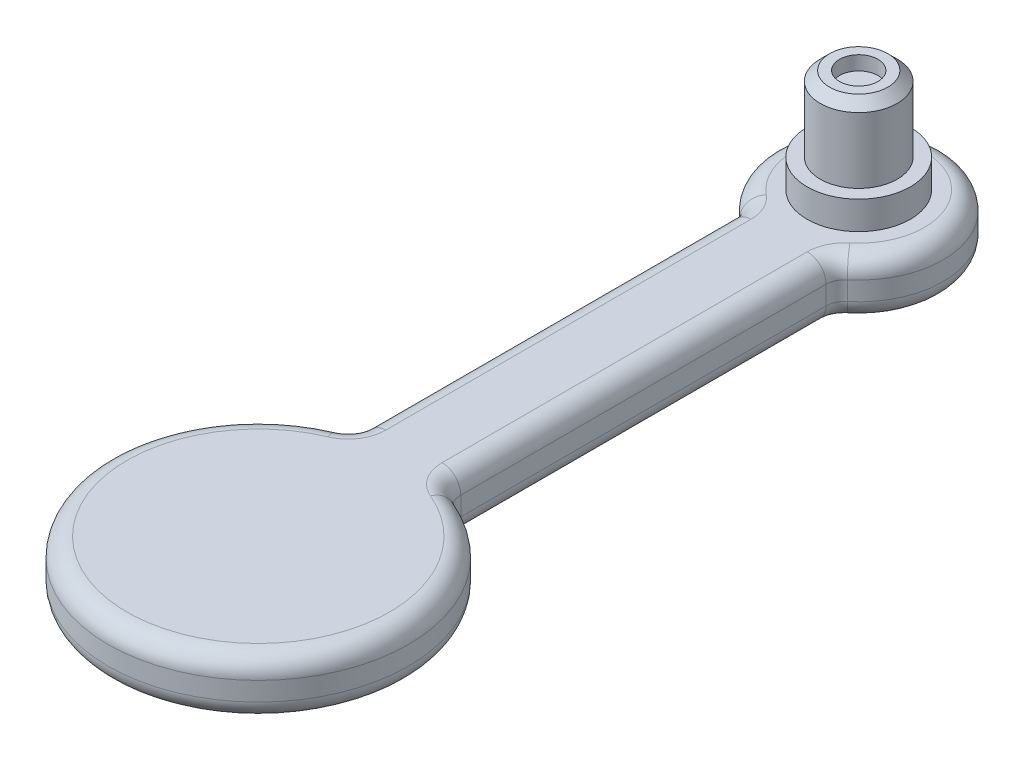
ISO-10303-21;
HEADER;
FILE_DESCRIPTION(('STEP AP214'),'2;1');
FILE_NAME('part.step','',(''),(''),'','','');
FILE_SCHEMA(('AUTOMOTIVE_DESIGN { 1 0 10303 214 1 1 1 1 }'));
ENDSEC;
DATA;
#1=APPLICATION_CONTEXT('core data for automotive mechanical design processes');
#2=APPLICATION_PROTOCOL_DEFINITION('international standard','automotive_design',2000,#1);
#3=PRODUCT_CONTEXT('',#1,'mechanical');
#4=PRODUCT('Part','Part','',(#3));
#5=PRODUCT_RELATED_PRODUCT_CATEGORY('part','',(#4));
#6=PRODUCT_DEFINITION_FORMATION('','',#4);
#7=PRODUCT_DEFINITION_CONTEXT('part definition',#1,'design');
#8=PRODUCT_DEFINITION('design','',#6,#7);
#9=PRODUCT_DEFINITION_SHAPE('','',#8);
#10=(LENGTH_UNIT() NAMED_UNIT(*) SI_UNIT(.MILLI.,.METRE.));
#11=(NAMED_UNIT(*) PLANE_ANGLE_UNIT() SI_UNIT($,.RADIAN.));
#12=(NAMED_UNIT(*) SI_UNIT($,.STERADIAN.) SOLID_ANGLE_UNIT());
#13=UNCERTAINTY_MEASURE_WITH_UNIT(LENGTH_MEASURE(1.E-05),#10,'distance_accuracy_value','');
#14=(GEOMETRIC_REPRESENTATION_CONTEXT(3) GLOBAL_UNCERTAINTY_ASSIGNED_CONTEXT((#13)) GLOBAL_UNIT_ASSIGNED_CONTEXT((#10,
#11,#12)) REPRESENTATION_CONTEXT('',''));
#15=CARTESIAN_POINT('',(0.,0.,0.));
#16=DIRECTION('',(0.,0.,1.));
#17=DIRECTION('',(1.,0.,0.));
#18=AXIS2_PLACEMENT_3D('',#15,#16,#17);
#19=CARTESIAN_POINT('',(0.,12.5,0.));
#20=DIRECTION('',(0.,-1.,0.));
#21=DIRECTION('',(0.,0.,-1.));
#22=AXIS2_PLACEMENT_3D('',#19,#20,#21);
#23=PLANE('',#22);
#24=CARTESIAN_POINT('',(0.,12.5,0.));
#25=DIRECTION('',(0.,-1.,0.));
#26=DIRECTION('',(1.,0.,0.));
#27=AXIS2_PLACEMENT_3D('',#24,#25,#26);
#28=CIRCLE('',#27,2.05);
#29=CARTESIAN_POINT('',(2.05,12.5,0.));
#30=VERTEX_POINT('',#29);
#31=EDGE_CURVE('E317',#30,#30,#28,.T.);
#32=ORIENTED_EDGE('',*,*,#31,.F.);
#33=EDGE_LOOP('',(#32));
#34=FACE_BOUND('',#33,.T.);
#35=ADVANCED_FACE('F18',(#34),#23,.F.);
#36=CARTESIAN_POINT('',(0.,14.5,0.));
#37=DIRECTION('',(0.,1.,0.));
#38=DIRECTION('',(1.,0.,0.));
#39=AXIS2_PLACEMENT_3D('',#36,#37,#38);
#40=CYLINDRICAL_SURFACE('',#39,2.05);
#41=ORIENTED_EDGE('',*,*,#31,.T.);
#42=EDGE_LOOP('',(#41));
#43=FACE_BOUND('',#42,.T.);
#44=CARTESIAN_POINT('',(0.,14.,0.));
#45=DIRECTION('',(0.,1.,0.));
#46=DIRECTION('',(1.,0.,0.));
#47=AXIS2_PLACEMENT_3D('',#44,#45,#46);
#48=CIRCLE('',#47,2.05);
#49=CARTESIAN_POINT('',(2.05,14.,0.));
#50=VERTEX_POINT('',#49);
#51=EDGE_CURVE('E322',#50,#50,#48,.T.);
#52=ORIENTED_EDGE('',*,*,#51,.T.);
#53=EDGE_LOOP('',(#52));
#54=FACE_BOUND('',#53,.T.);
#55=ADVANCED_FACE('F749',(#43,#54),#40,.F.);
#56=CARTESIAN_POINT('',(0.,14.,0.));
#57=DIRECTION('',(0.,1.,0.));
#58=DIRECTION('',(1.,0.,0.));
#59=AXIS2_PLACEMENT_3D('',#56,#57,#58);
#60=PLANE('',#59);
#61=ORIENTED_EDGE('',*,*,#51,.F.);
#62=EDGE_LOOP('',(#61));
#63=FACE_BOUND('',#62,.T.);
#64=CARTESIAN_POINT('',(0.,14.,0.));
#65=DIRECTION('',(0.,1.,0.));
#66=DIRECTION('',(1.,0.,0.));
#67=AXIS2_PLACEMENT_3D('',#64,#65,#66);
#68=CIRCLE('',#67,3.1);
#69=CARTESIAN_POINT('',(3.1,14.,0.));
#70=VERTEX_POINT('',#69);
#71=EDGE_CURVE('E390',#70,#70,#68,.T.);
#72=ORIENTED_EDGE('',*,*,#71,.T.);
#73=EDGE_LOOP('',(#72));
#74=FACE_BOUND('',#73,.T.);
#75=ADVANCED_FACE('F739',(#63,#74),#60,.T.);
#76=CARTESIAN_POINT('',(0.,13.,0.));
#77=DIRECTION('',(0.,-1.,0.));
#78=DIRECTION('',(1.,0.,0.));
#79=AXIS2_PLACEMENT_3D('',#76,#77,#78);
#80=CONICAL_SURFACE('',#79,4.1,0.785398163397);
#81=ORIENTED_EDGE('',*,*,#71,.F.);
#82=EDGE_LOOP('',(#81));
#83=FACE_BOUND('',#82,.T.);
#84=CARTESIAN_POINT('',(0.,13.,0.));
#85=DIRECTION('',(0.,1.,0.));
#86=DIRECTION('',(1.,0.,0.));
#87=AXIS2_PLACEMENT_3D('',#84,#85,#86);
#88=CIRCLE('',#87,4.1);
#89=CARTESIAN_POINT('',(4.1,13.,0.));
#90=VERTEX_POINT('',#89);
#91=EDGE_CURVE('E360',#90,#90,#88,.T.);
#92=ORIENTED_EDGE('',*,*,#91,.T.);
#93=EDGE_LOOP('',(#92));
#94=FACE_BOUND('',#93,.T.);
#95=ADVANCED_FACE('F729',(#83,#94),#80,.T.);
#96=CARTESIAN_POINT('',(0.,6.,0.));
#97=DIRECTION('',(0.,1.,0.));
#98=DIRECTION('',(1.,0.,0.));
#99=AXIS2_PLACEMENT_3D('',#96,#97,#98);
#100=CYLINDRICAL_SURFACE('',#99,4.1);
#101=ORIENTED_EDGE('',*,*,#91,.F.);
#102=EDGE_LOOP('',(#101));
#103=FACE_BOUND('',#102,.T.);
#104=CARTESIAN_POINT('',(0.,6.,0.));
#105=DIRECTION('',(0.,1.,0.));
#106=DIRECTION('',(1.,0.,0.));
#107=AXIS2_PLACEMENT_3D('',#104,#105,#106);
#108=CIRCLE('',#107,4.1);
#109=CARTESIAN_POINT('',(4.1,6.,0.));
#110=VERTEX_POINT('',#109);
#111=EDGE_CURVE('E341',#110,#110,#108,.T.);
#112=ORIENTED_EDGE('',*,*,#111,.T.);
#113=EDGE_LOOP('',(#112));
#114=FACE_BOUND('',#113,.T.);
#115=ADVANCED_FACE('F718',(#103,#114),#100,.T.);
#116=CARTESIAN_POINT('',(0.,6.,0.));
#117=DIRECTION('',(0.,1.,0.));
#118=DIRECTION('',(1.,0.,0.));
#119=AXIS2_PLACEMENT_3D('',#116,#117,#118);
#120=PLANE('',#119);
#121=ORIENTED_EDGE('',*,*,#111,.F.);
#122=EDGE_LOOP('',(#121));
#123=FACE_BOUND('',#122,.T.);
#124=CARTESIAN_POINT('',(0.,6.,0.));
#125=DIRECTION('',(0.,1.,0.));
#126=DIRECTION('',(1.,0.,0.));
#127=AXIS2_PLACEMENT_3D('',#124,#125,#126);
#128=CIRCLE('',#127,5.5);
#129=CARTESIAN_POINT('',(5.5,6.,0.));
#130=VERTEX_POINT('',#129);
#131=EDGE_CURVE('E345',#130,#130,#128,.T.);
#132=ORIENTED_EDGE('',*,*,#131,.T.);
#133=EDGE_LOOP('',(#132));
#134=FACE_BOUND('',#133,.T.);
#135=ADVANCED_FACE('F711',(#123,#134),#120,.T.);
#136=CARTESIAN_POINT('',(0.,3.,0.));
#137=DIRECTION('',(0.,1.,0.));
#138=DIRECTION('',(1.,0.,0.));
#139=AXIS2_PLACEMENT_3D('',#136,#137,#138);
#140=CYLINDRICAL_SURFACE('',#139,9.);
#141=CARTESIAN_POINT('',(0.,1.001,0.));
#142=DIRECTION('',(0.,-1.,0.));
#143=DIRECTION('',(-0.636363636363789,0.,0.771389215839744));
#144=AXIS2_PLACEMENT_3D('',#141,#142,#143);
#145=CIRCLE('',#144,9.);
#146=CARTESIAN_POINT('',(-5.727272727273,1.001,6.942502942559));
#147=VERTEX_POINT('',#146);
#148=CARTESIAN_POINT('',(5.727272727273,1.001,6.942502942559));
#149=VERTEX_POINT('',#148);
#150=EDGE_CURVE('E378',#147,#149,#145,.T.);
#151=ORIENTED_EDGE('',*,*,#150,.T.);
#152=DIRECTION('',(0.,1.,0.));
#153=VECTOR('',#152,1.);
#154=CARTESIAN_POINT('',(5.727272727273,-3.,6.942502942559));
#155=LINE('',#154,#153);
#156=CARTESIAN_POINT('',(5.727272727273,-1.001,6.942502942559));
#157=VERTEX_POINT('',#156);
#158=EDGE_CURVE('E225',#157,#149,#155,.T.);
#159=ORIENTED_EDGE('',*,*,#158,.F.);
#160=CARTESIAN_POINT('',(0.,-1.001,0.));
#161=DIRECTION('',(0.,1.,0.));
#162=DIRECTION('',(0.636363636363789,0.,0.771389215839744));
#163=AXIS2_PLACEMENT_3D('',#160,#161,#162);
#164=CIRCLE('',#163,9.);
#165=CARTESIAN_POINT('',(-5.727272727273,-1.001,6.942502942559));
#166=VERTEX_POINT('',#165);
#167=EDGE_CURVE('E273',#157,#166,#164,.T.);
#168=ORIENTED_EDGE('',*,*,#167,.T.);
#169=DIRECTION('',(0.,1.,0.));
#170=VECTOR('',#169,1.);
#171=CARTESIAN_POINT('',(-5.727272727273,-3.,6.942502942559));
#172=LINE('',#171,#170);
#173=EDGE_CURVE('E37',#166,#147,#172,.T.);
#174=ORIENTED_EDGE('',*,*,#173,.T.);
#175=EDGE_LOOP('',(#151,#159,#168,#174));
#176=FACE_BOUND('',#175,.T.);
#177=ADVANCED_FACE('F703',(#176),#140,.T.);
#178=CARTESIAN_POINT('',(-7.,-3.,8.485281374239));
#179=DIRECTION('',(0.,1.,0.));
#180=DIRECTION('',(1.,0.,0.));
#181=AXIS2_PLACEMENT_3D('',#178,#179,#180);
#182=CYLINDRICAL_SURFACE('',#181,2.);
#183=CARTESIAN_POINT('',(-7.,1.001,8.485281374239));
#184=DIRECTION('',(0.,1.,0.));
#185=DIRECTION('',(1.,0.,0.));
#186=AXIS2_PLACEMENT_3D('',#183,#184,#185);
#187=CIRCLE('',#186,2.);
#188=CARTESIAN_POINT('',(-5.,1.001,8.485281374239));
#189=VERTEX_POINT('',#188);
#190=EDGE_CURVE('E380',#189,#147,#187,.T.);
#191=ORIENTED_EDGE('',*,*,#190,.T.);
#192=ORIENTED_EDGE('',*,*,#173,.F.);
#193=CARTESIAN_POINT('',(-7.,-1.001,8.485281374239));
#194=DIRECTION('',(0.,-1.,0.));
#195=DIRECTION('',(0.636363636363789,0.,-0.771389215839744));
#196=AXIS2_PLACEMENT_3D('',#193,#194,#195);
#197=CIRCLE('',#196,2.);
#198=CARTESIAN_POINT('',(-5.,-1.001,8.485281374239));
#199=VERTEX_POINT('',#198);
#200=EDGE_CURVE('E364',#166,#199,#197,.T.);
#201=ORIENTED_EDGE('',*,*,#200,.T.);
#202=DIRECTION('',(0.,1.,0.));
#203=VECTOR('',#202,1.);
#204=CARTESIAN_POINT('',(-5.,-3.,8.485281374239));
#205=LINE('',#204,#203);
#206=EDGE_CURVE('E259',#199,#189,#205,.T.);
#207=ORIENTED_EDGE('',*,*,#206,.T.);
#208=EDGE_LOOP('',(#191,#192,#201,#207));
#209=FACE_BOUND('',#208,.T.);
#210=ADVANCED_FACE('F691',(#209),#182,.F.);
#211=CARTESIAN_POINT('',(0.,2.5,0.));
#212=DIRECTION('',(0.,1.,0.));
#213=DIRECTION('',(1.,0.,0.));
#214=AXIS2_PLACEMENT_3D('',#211,#212,#213);
#215=CYLINDRICAL_SURFACE('',#214,5.5);
#216=ORIENTED_EDGE('',*,*,#131,.F.);
#217=EDGE_LOOP('',(#216));
#218=FACE_BOUND('',#217,.T.);
#219=CARTESIAN_POINT('',(0.,3.,0.));
#220=DIRECTION('',(0.,1.,0.));
#221=DIRECTION('',(1.,0.,0.));
#222=AXIS2_PLACEMENT_3D('',#219,#220,#221);
#223=CIRCLE('',#222,5.5);
#224=CARTESIAN_POINT('',(5.5,3.,0.));
#225=VERTEX_POINT('',#224);
#226=EDGE_CURVE('E284',#225,#225,#223,.T.);
#227=ORIENTED_EDGE('',*,*,#226,.T.);
#228=EDGE_LOOP('',(#227));
#229=FACE_BOUND('',#228,.T.);
#230=ADVANCED_FACE('F682',(#218,#229),#215,.T.);
#231=CARTESIAN_POINT('',(0.,1.001,0.));
#232=DIRECTION('',(0.,1.,0.));
#233=DIRECTION('',(-0.636363636363789,0.,0.771389215839744));
#234=AXIS2_PLACEMENT_3D('',#231,#232,#233);
#235=TOROIDAL_SURFACE('',#234,7.001,1.999);
#236=CARTESIAN_POINT('',(0.,3.,0.));
#237=DIRECTION('',(0.,-1.,0.));
#238=DIRECTION('',(-0.636363636363789,0.,0.771389215839744));
#239=AXIS2_PLACEMENT_3D('',#236,#237,#238);
#240=CIRCLE('',#239,7.001);
#241=CARTESIAN_POINT('',(-4.455181818182,3.,5.400495900095));
#242=VERTEX_POINT('',#241);
#243=CARTESIAN_POINT('',(4.455181818182,3.,5.400495900095));
#244=VERTEX_POINT('',#243);
#245=EDGE_CURVE('E318',#242,#244,#240,.T.);
#246=ORIENTED_EDGE('',*,*,#245,.T.);
#247=CARTESIAN_POINT('',(4.455181818182,1.001,5.400495900095));
#248=DIRECTION('',(-0.771389215839744,0.,0.636363636363789));
#249=DIRECTION('',(0.636363636363789,0.,0.771389215839744));
#250=AXIS2_PLACEMENT_3D('',#247,#248,#249);
#251=CIRCLE('',#250,1.999);
#252=EDGE_CURVE('E305',#149,#244,#251,.T.);
#253=ORIENTED_EDGE('',*,*,#252,.F.);
#254=ORIENTED_EDGE('',*,*,#150,.F.);
#255=CARTESIAN_POINT('',(-4.455181818182,1.001,5.400495900095));
#256=DIRECTION('',(-0.771389215839744,0.,-0.636363636363789));
#257=DIRECTION('',(0.636363636363789,0.,-0.771389215839744));
#258=AXIS2_PLACEMENT_3D('',#255,#256,#257);
#259=CIRCLE('',#258,1.999);
#260=EDGE_CURVE('E303',#147,#242,#259,.T.);
#261=ORIENTED_EDGE('',*,*,#260,.T.);
#262=EDGE_LOOP('',(#246,#253,#254,#261));
#263=FACE_BOUND('',#262,.T.);
#264=ADVANCED_FACE('F673',(#263),#235,.T.);
#265=CARTESIAN_POINT('',(-7.,1.001,8.485281374239));
#266=DIRECTION('',(0.,-1.,0.));
#267=DIRECTION('',(1.,0.,0.));
#268=AXIS2_PLACEMENT_3D('',#265,#266,#267);
#269=TOROIDAL_SURFACE('',#268,3.999,1.999);
#270=CARTESIAN_POINT('',(-7.,3.,8.485281374239));
#271=DIRECTION('',(0.,1.,0.));
#272=DIRECTION('',(1.,0.,0.));
#273=AXIS2_PLACEMENT_3D('',#270,#271,#272);
#274=CIRCLE('',#273,3.999);
#275=CARTESIAN_POINT('',(-3.001,3.,8.485281374239));
#276=VERTEX_POINT('',#275);
#277=EDGE_CURVE('E327',#276,#242,#274,.T.);
#278=ORIENTED_EDGE('',*,*,#277,.T.);
#279=ORIENTED_EDGE('',*,*,#260,.F.);
#280=ORIENTED_EDGE('',*,*,#190,.F.);
#281=CARTESIAN_POINT('',(-3.001,1.001,8.485281374239));
#282=DIRECTION('',(0.,0.,-1.));
#283=DIRECTION('',(-1.,0.,0.));
#284=AXIS2_PLACEMENT_3D('',#281,#282,#283);
#285=CIRCLE('',#284,1.999);
#286=EDGE_CURVE('E280',#189,#276,#285,.T.);
#287=ORIENTED_EDGE('',*,*,#286,.T.);
#288=EDGE_LOOP('',(#278,#279,#280,#287));
#289=FACE_BOUND('',#288,.T.);
#290=ADVANCED_FACE('F664',(#289),#269,.T.);
#291=CARTESIAN_POINT('',(7.,1.001,8.485281374239));
#292=DIRECTION('',(0.,-1.,0.));
#293=DIRECTION('',(-0.636363636363789,0.,-0.771389215839744));
#294=AXIS2_PLACEMENT_3D('',#291,#292,#293);
#295=TOROIDAL_SURFACE('',#294,3.999,1.999);
#296=CARTESIAN_POINT('',(7.,3.,8.485281374239));
#297=DIRECTION('',(0.,1.,0.));
#298=DIRECTION('',(-0.636363636363789,0.,-0.771389215839744));
#299=AXIS2_PLACEMENT_3D('',#296,#297,#298);
#300=CIRCLE('',#299,3.999);
#301=CARTESIAN_POINT('',(3.001,3.,8.485281374239));
#302=VERTEX_POINT('',#301);
#303=EDGE_CURVE('E314',#244,#302,#300,.T.);
#304=ORIENTED_EDGE('',*,*,#303,.T.);
#305=CARTESIAN_POINT('',(3.001,1.001,8.485281374239));
#306=DIRECTION('',(0.,0.,1.));
#307=DIRECTION('',(-1.,0.,0.));
#308=AXIS2_PLACEMENT_3D('',#305,#306,#307);
#309=CIRCLE('',#308,1.999);
#310=CARTESIAN_POINT('',(5.,1.001,8.485281374239));
#311=VERTEX_POINT('',#310);
#312=EDGE_CURVE('E249',#311,#302,#309,.T.);
#313=ORIENTED_EDGE('',*,*,#312,.F.);
#314=CARTESIAN_POINT('',(7.,1.001,8.485281374239));
#315=DIRECTION('',(0.,1.,0.));
#316=DIRECTION('',(-0.636363636363789,0.,-0.771389215839744));
#317=AXIS2_PLACEMENT_3D('',#314,#315,#316);
#318=CIRCLE('',#317,2.);
#319=EDGE_CURVE('E244',#149,#311,#318,.T.);
#320=ORIENTED_EDGE('',*,*,#319,.F.);
#321=ORIENTED_EDGE('',*,*,#252,.T.);
#322=EDGE_LOOP('',(#304,#313,#320,#321));
#323=FACE_BOUND('',#322,.T.);
#324=ADVANCED_FACE('F653',(#323),#295,.T.);
#325=CARTESIAN_POINT('',(-3.001,1.001,47.416876048223));
#326=DIRECTION('',(0.,0.,-1.));
#327=DIRECTION('',(-1.,0.,0.));
#328=AXIS2_PLACEMENT_3D('',#325,#326,#327);
#329=CYLINDRICAL_SURFACE('',#328,1.999);
#330=CARTESIAN_POINT('',(-3.001,1.001,47.416876048223));
#331=DIRECTION('',(0.,0.,-1.));
#332=DIRECTION('',(1.,0.,0.));
#333=AXIS2_PLACEMENT_3D('',#330,#331,#332);
#334=CIRCLE('',#333,1.999);
#335=CARTESIAN_POINT('',(-5.,1.001,47.416876048223));
#336=VERTEX_POINT('',#335);
#337=CARTESIAN_POINT('',(-3.001,3.,47.416876048223));
#338=VERTEX_POINT('',#337);
#339=EDGE_CURVE('E339',#336,#338,#334,.T.);
#340=ORIENTED_EDGE('',*,*,#339,.T.);
#341=DIRECTION('',(0.,0.,-1.));
#342=VECTOR('',#341,1.);
#343=CARTESIAN_POINT('',(-3.001,3.,47.416876048223));
#344=LINE('',#343,#342);
#345=EDGE_CURVE('E283',#338,#276,#344,.T.);
#346=ORIENTED_EDGE('',*,*,#345,.T.);
#347=ORIENTED_EDGE('',*,*,#286,.F.);
#348=DIRECTION('',(0.,0.,-1.));
#349=VECTOR('',#348,1.);
#350=CARTESIAN_POINT('',(-5.,1.001,47.416876048223));
#351=LINE('',#350,#349);
#352=EDGE_CURVE('E344',#336,#189,#351,.T.);
#353=ORIENTED_EDGE('',*,*,#352,.F.);
#354=EDGE_LOOP('',(#340,#346,#347,#353));
#355=FACE_BOUND('',#354,.T.);
#356=ADVANCED_FACE('F641',(#355),#329,.T.);
#357=CARTESIAN_POINT('',(0.,-1.001,0.));
#358=DIRECTION('',(0.,-1.,0.));
#359=DIRECTION('',(0.636363636363789,0.,0.771389215839744));
#360=AXIS2_PLACEMENT_3D('',#357,#358,#359);
#361=TOROIDAL_SURFACE('',#360,7.001,1.999);
#362=CARTESIAN_POINT('',(0.,-3.,0.));
#363=DIRECTION('',(0.,1.,0.));
#364=DIRECTION('',(0.636363636363789,0.,0.771389215839744));
#365=AXIS2_PLACEMENT_3D('',#362,#363,#364);
#366=CIRCLE('',#365,7.001);
#367=CARTESIAN_POINT('',(4.455181818182,-3.,5.400495900095));
#368=VERTEX_POINT('',#367);
#369=CARTESIAN_POINT('',(-4.455181818182,-3.,5.400495900095));
#370=VERTEX_POINT('',#369);
#371=EDGE_CURVE('E302',#368,#370,#366,.T.);
#372=ORIENTED_EDGE('',*,*,#371,.T.);
#373=CARTESIAN_POINT('',(-4.455181818182,-1.001,5.400495900095));
#374=DIRECTION('',(0.771389215839744,0.,0.636363636363789));
#375=DIRECTION('',(-0.636363636363789,0.,0.771389215839744));
#376=AXIS2_PLACEMENT_3D('',#373,#374,#375);
#377=CIRCLE('',#376,1.999);
#378=EDGE_CURVE('E366',#166,#370,#377,.T.);
#379=ORIENTED_EDGE('',*,*,#378,.F.);
#380=ORIENTED_EDGE('',*,*,#167,.F.);
#381=CARTESIAN_POINT('',(4.455181818182,-1.001,5.400495900095));
#382=DIRECTION('',(0.771389215839744,0.,-0.636363636363789));
#383=DIRECTION('',(-0.636363636363789,0.,-0.771389215839744));
#384=AXIS2_PLACEMENT_3D('',#381,#382,#383);
#385=CIRCLE('',#384,1.999);
#386=EDGE_CURVE('E279',#157,#368,#385,.T.);
#387=ORIENTED_EDGE('',*,*,#386,.T.);
#388=EDGE_LOOP('',(#372,#379,#380,#387));
#389=FACE_BOUND('',#388,.T.);
#390=ADVANCED_FACE('F634',(#389),#361,.T.);
#391=CARTESIAN_POINT('',(7.,-1.001,8.485281374239));
#392=DIRECTION('',(0.,1.,0.));
#393=DIRECTION('',(-1.,0.,0.));
#394=AXIS2_PLACEMENT_3D('',#391,#392,#393);
#395=TOROIDAL_SURFACE('',#394,3.999,1.999);
#396=CARTESIAN_POINT('',(7.,-3.,8.485281374239));
#397=DIRECTION('',(0.,-1.,0.));
#398=DIRECTION('',(-1.,0.,0.));
#399=AXIS2_PLACEMENT_3D('',#396,#397,#398);
#400=CIRCLE('',#399,3.999);
#401=CARTESIAN_POINT('',(3.001,-3.,8.485281374239));
#402=VERTEX_POINT('',#401);
#403=EDGE_CURVE('E240',#402,#368,#400,.T.);
#404=ORIENTED_EDGE('',*,*,#403,.T.);
#405=ORIENTED_EDGE('',*,*,#386,.F.);
#406=CARTESIAN_POINT('',(7.,-1.001,8.485281374239));
#407=DIRECTION('',(0.,-1.,0.));
#408=DIRECTION('',(-1.,0.,0.));
#409=AXIS2_PLACEMENT_3D('',#406,#407,#408);
#410=CIRCLE('',#409,2.);
#411=CARTESIAN_POINT('',(5.,-1.001,8.485281374239));
#412=VERTEX_POINT('',#411);
#413=EDGE_CURVE('E227',#412,#157,#410,.T.);
#414=ORIENTED_EDGE('',*,*,#413,.F.);
#415=CARTESIAN_POINT('',(3.001,-1.001,8.485281374239));
#416=DIRECTION('',(0.,0.,-1.));
#417=DIRECTION('',(1.,0.,0.));
#418=AXIS2_PLACEMENT_3D('',#415,#416,#417);
#419=CIRCLE('',#418,1.999);
#420=EDGE_CURVE('E256',#412,#402,#419,.T.);
#421=ORIENTED_EDGE('',*,*,#420,.T.);
#422=EDGE_LOOP('',(#404,#405,#414,#421));
#423=FACE_BOUND('',#422,.T.);
#424=ADVANCED_FACE('F623',(#423),#395,.T.);
#425=CARTESIAN_POINT('',(-7.,-1.001,8.485281374239));
#426=DIRECTION('',(0.,1.,0.));
#427=DIRECTION('',(0.636363636363789,0.,-0.771389215839744));
#428=AXIS2_PLACEMENT_3D('',#425,#426,#427);
#429=TOROIDAL_SURFACE('',#428,3.999,1.999);
#430=CARTESIAN_POINT('',(-7.,-3.,8.485281374239));
#431=DIRECTION('',(0.,-1.,0.));
#432=DIRECTION('',(0.636363636363789,0.,-0.771389215839744));
#433=AXIS2_PLACEMENT_3D('',#430,#431,#432);
#434=CIRCLE('',#433,3.999);
#435=CARTESIAN_POINT('',(-3.001,-3.,8.485281374239));
#436=VERTEX_POINT('',#435);
#437=EDGE_CURVE('E300',#370,#436,#434,.T.);
#438=ORIENTED_EDGE('',*,*,#437,.T.);
#439=CARTESIAN_POINT('',(-3.001,-1.001,8.485281374239));
#440=DIRECTION('',(0.,0.,1.));
#441=DIRECTION('',(1.,0.,0.));
#442=AXIS2_PLACEMENT_3D('',#439,#440,#441);
#443=CIRCLE('',#442,1.999);
#444=EDGE_CURVE('E226',#199,#436,#443,.T.);
#445=ORIENTED_EDGE('',*,*,#444,.F.);
#446=ORIENTED_EDGE('',*,*,#200,.F.);
#447=ORIENTED_EDGE('',*,*,#378,.T.);
#448=EDGE_LOOP('',(#438,#445,#446,#447));
#449=FACE_BOUND('',#448,.T.);
#450=ADVANCED_FACE('F614',(#449),#429,.T.);
#451=CARTESIAN_POINT('',(-3.001,-1.001,8.485281374239));
#452=DIRECTION('',(0.,0.,1.));
#453=DIRECTION('',(-1.,0.,0.));
#454=AXIS2_PLACEMENT_3D('',#451,#452,#453);
#455=CYLINDRICAL_SURFACE('',#454,1.999);
#456=ORIENTED_EDGE('',*,*,#444,.T.);
#457=DIRECTION('',(0.,0.,1.));
#458=VECTOR('',#457,1.);
#459=CARTESIAN_POINT('',(-3.001,-3.,8.485281374239));
#460=LINE('',#459,#458);
#461=CARTESIAN_POINT('',(-3.001,-3.,47.416876048223));
#462=VERTEX_POINT('',#461);
#463=EDGE_CURVE('E292',#436,#462,#460,.T.);
#464=ORIENTED_EDGE('',*,*,#463,.T.);
#465=CARTESIAN_POINT('',(-3.001,-1.001,47.416876048223));
#466=DIRECTION('',(0.,0.,1.));
#467=DIRECTION('',(-1.,0.,0.));
#468=AXIS2_PLACEMENT_3D('',#465,#466,#467);
#469=CIRCLE('',#468,1.999);
#470=CARTESIAN_POINT('',(-5.,-1.001,47.416876048223));
#471=VERTEX_POINT('',#470);
#472=EDGE_CURVE('E289',#471,#462,#469,.T.);
#473=ORIENTED_EDGE('',*,*,#472,.F.);
#474=DIRECTION('',(0.,0.,1.));
#475=VECTOR('',#474,1.);
#476=CARTESIAN_POINT('',(-5.,-1.001,8.485281374239));
#477=LINE('',#476,#475);
#478=EDGE_CURVE('E254',#199,#471,#477,.T.);
#479=ORIENTED_EDGE('',*,*,#478,.F.);
#480=EDGE_LOOP('',(#456,#464,#473,#479));
#481=FACE_BOUND('',#480,.T.);
#482=ADVANCED_FACE('F603',(#481),#455,.T.);
#483=CARTESIAN_POINT('',(7.,-3.,8.485281374239));
#484=DIRECTION('',(0.,1.,0.));
#485=DIRECTION('',(-0.636363636363789,0.,-0.771389215839744));
#486=AXIS2_PLACEMENT_3D('',#483,#484,#485);
#487=CYLINDRICAL_SURFACE('',#486,2.);
#488=ORIENTED_EDGE('',*,*,#319,.T.);
#489=DIRECTION('',(0.,1.,0.));
#490=VECTOR('',#489,1.);
#491=CARTESIAN_POINT('',(5.,-3.,8.485281374239));
#492=LINE('',#491,#490);
#493=EDGE_CURVE('E178',#412,#311,#492,.T.);
#494=ORIENTED_EDGE('',*,*,#493,.F.);
#495=ORIENTED_EDGE('',*,*,#413,.T.);
#496=ORIENTED_EDGE('',*,*,#158,.T.);
#497=EDGE_LOOP('',(#488,#494,#495,#496));
#498=FACE_BOUND('',#497,.T.);
#499=ADVANCED_FACE('F594',(#498),#487,.F.);
#500=CARTESIAN_POINT('',(3.001,1.001,8.485281374239));
#501=DIRECTION('',(0.,0.,1.));
#502=DIRECTION('',(1.,0.,0.));
#503=AXIS2_PLACEMENT_3D('',#500,#501,#502);
#504=CYLINDRICAL_SURFACE('',#503,1.999);
#505=ORIENTED_EDGE('',*,*,#312,.T.);
#506=DIRECTION('',(0.,0.,1.));
#507=VECTOR('',#506,1.);
#508=CARTESIAN_POINT('',(3.001,3.,8.485281374239));
#509=LINE('',#508,#507);
#510=CARTESIAN_POINT('',(3.001,3.,47.416876048223));
#511=VERTEX_POINT('',#510);
#512=EDGE_CURVE('E187',#302,#511,#509,.T.);
#513=ORIENTED_EDGE('',*,*,#512,.T.);
#514=CARTESIAN_POINT('',(3.001,1.001,47.416876048223));
#515=DIRECTION('',(0.,0.,1.));
#516=DIRECTION('',(1.,0.,0.));
#517=AXIS2_PLACEMENT_3D('',#514,#515,#516);
#518=CIRCLE('',#517,1.999);
#519=CARTESIAN_POINT('',(5.,1.001,47.416876048223));
#520=VERTEX_POINT('',#519);
#521=EDGE_CURVE('E181',#520,#511,#518,.T.);
#522=ORIENTED_EDGE('',*,*,#521,.F.);
#523=DIRECTION('',(0.,0.,1.));
#524=VECTOR('',#523,1.);
#525=CARTESIAN_POINT('',(5.,1.001,8.485281374239));
#526=LINE('',#525,#524);
#527=EDGE_CURVE('E168',#311,#520,#526,.T.);
#528=ORIENTED_EDGE('',*,*,#527,.F.);
#529=EDGE_LOOP('',(#505,#513,#522,#528));
#530=FACE_BOUND('',#529,.T.);
#531=ADVANCED_FACE('F186',(#530),#504,.T.);
#532=CARTESIAN_POINT('',(3.001,-1.001,47.416876048223));
#533=DIRECTION('',(0.,0.,-1.));
#534=DIRECTION('',(1.,0.,0.));
#535=AXIS2_PLACEMENT_3D('',#532,#533,#534);
#536=CYLINDRICAL_SURFACE('',#535,1.999);
#537=CARTESIAN_POINT('',(3.001,-1.001,47.416876048223));
#538=DIRECTION('',(0.,0.,-1.));
#539=DIRECTION('',(-1.,0.,0.));
#540=AXIS2_PLACEMENT_3D('',#537,#538,#539);
#541=CIRCLE('',#540,1.999);
#542=CARTESIAN_POINT('',(5.,-1.001,47.416876048223));
#543=VERTEX_POINT('',#542);
#544=CARTESIAN_POINT('',(3.001,-3.,47.416876048223));
#545=VERTEX_POINT('',#544);
#546=EDGE_CURVE('E266',#543,#545,#541,.T.);
#547=ORIENTED_EDGE('',*,*,#546,.T.);
#548=DIRECTION('',(0.,0.,-1.));
#549=VECTOR('',#548,1.);
#550=CARTESIAN_POINT('',(3.001,-3.,47.416876048223));
#551=LINE('',#550,#549);
#552=EDGE_CURVE('E235',#545,#402,#551,.T.);
#553=ORIENTED_EDGE('',*,*,#552,.T.);
#554=ORIENTED_EDGE('',*,*,#420,.F.);
#555=DIRECTION('',(0.,0.,-1.));
#556=VECTOR('',#555,1.);
#557=CARTESIAN_POINT('',(5.,-1.001,47.416876048223));
#558=LINE('',#557,#556);
#559=EDGE_CURVE('E185',#543,#412,#558,.T.);
#560=ORIENTED_EDGE('',*,*,#559,.F.);
#561=EDGE_LOOP('',(#547,#553,#554,#560));
#562=FACE_BOUND('',#561,.T.);
#563=ADVANCED_FACE('F577',(#562),#536,.T.);
#564=CARTESIAN_POINT('',(-5.,3.,64.));
#565=DIRECTION('',(1.,0.,0.));
#566=DIRECTION('',(0.,1.,0.));
#567=AXIS2_PLACEMENT_3D('',#564,#565,#566);
#568=PLANE('',#567);
#569=ORIENTED_EDGE('',*,*,#352,.T.);
#570=ORIENTED_EDGE('',*,*,#206,.F.);
#571=ORIENTED_EDGE('',*,*,#478,.T.);
#572=DIRECTION('',(0.,1.,0.));
#573=VECTOR('',#572,1.);
#574=CARTESIAN_POINT('',(-5.,-3.,47.416876048223));
#575=LINE('',#574,#573);
#576=EDGE_CURVE('E216',#471,#336,#575,.T.);
#577=ORIENTED_EDGE('',*,*,#576,.T.);
#578=EDGE_LOOP('',(#569,#570,#571,#577));
#579=FACE_BOUND('',#578,.T.);
#580=ADVANCED_FACE('F570',(#579),#568,.F.);
#581=CARTESIAN_POINT('',(-7.,1.001,47.416876048223));
#582=DIRECTION('',(0.,-1.,0.));
#583=DIRECTION('',(0.388888888888844,0.,0.92128466398763));
#584=AXIS2_PLACEMENT_3D('',#581,#582,#583);
#585=TOROIDAL_SURFACE('',#584,3.999,1.999);
#586=CARTESIAN_POINT('',(-7.,3.,47.416876048223));
#587=DIRECTION('',(0.,1.,0.));
#588=DIRECTION('',(0.388888888888844,0.,0.92128466398763));
#589=AXIS2_PLACEMENT_3D('',#586,#587,#588);
#590=CIRCLE('',#589,3.999);
#591=CARTESIAN_POINT('',(-5.444833333333,3.,51.101093419509));
#592=VERTEX_POINT('',#591);
#593=EDGE_CURVE('E276',#592,#338,#590,.T.);
#594=ORIENTED_EDGE('',*,*,#593,.T.);
#595=ORIENTED_EDGE('',*,*,#339,.F.);
#596=CARTESIAN_POINT('',(-7.,1.001,47.416876048223));
#597=DIRECTION('',(0.,1.,0.));
#598=DIRECTION('',(0.388888888888844,0.,0.92128466398763));
#599=AXIS2_PLACEMENT_3D('',#596,#597,#598);
#600=CIRCLE('',#599,2.);
#601=CARTESIAN_POINT('',(-6.222222222222,1.001,49.259445376198));
#602=VERTEX_POINT('',#601);
#603=EDGE_CURVE('E222',#602,#336,#600,.T.);
#604=ORIENTED_EDGE('',*,*,#603,.F.);
#605=CARTESIAN_POINT('',(-5.444833333333,1.001,51.101093419509));
#606=DIRECTION('',(0.92128466398763,0.,-0.388888888888844));
#607=DIRECTION('',(-0.388888888888844,0.,-0.92128466398763));
#608=AXIS2_PLACEMENT_3D('',#605,#606,#607);
#609=CIRCLE('',#608,1.999);
#610=EDGE_CURVE('E253',#602,#592,#609,.T.);
#611=ORIENTED_EDGE('',*,*,#610,.T.);
#612=EDGE_LOOP('',(#594,#595,#604,#611));
#613=FACE_BOUND('',#612,.T.);
#614=ADVANCED_FACE('F553',(#613),#585,.T.);
#615=CARTESIAN_POINT('',(0.,3.,64.));
#616=DIRECTION('',(0.,-1.,0.));
#617=DIRECTION('',(0.,0.,-1.));
#618=AXIS2_PLACEMENT_3D('',#615,#616,#617);
#619=PLANE('',#618);
#620=ORIENTED_EDGE('',*,*,#226,.F.);
#621=EDGE_LOOP('',(#620));
#622=FACE_BOUND('',#621,.T.);
#623=CARTESIAN_POINT('',(7.,3.,47.416876048223));
#624=DIRECTION('',(0.,1.,0.));
#625=DIRECTION('',(-1.,0.,0.));
#626=AXIS2_PLACEMENT_3D('',#623,#624,#625);
#627=CIRCLE('',#626,3.999);
#628=CARTESIAN_POINT('',(5.444833333333,3.,51.101093419509));
#629=VERTEX_POINT('',#628);
#630=EDGE_CURVE('E195',#511,#629,#627,.T.);
#631=ORIENTED_EDGE('',*,*,#630,.F.);
#632=ORIENTED_EDGE('',*,*,#512,.F.);
#633=ORIENTED_EDGE('',*,*,#303,.F.);
#634=ORIENTED_EDGE('',*,*,#245,.F.);
#635=ORIENTED_EDGE('',*,*,#277,.F.);
#636=ORIENTED_EDGE('',*,*,#345,.F.);
#637=ORIENTED_EDGE('',*,*,#593,.F.);
#638=CARTESIAN_POINT('',(0.,3.,64.));
#639=DIRECTION('',(0.,-1.,0.));
#640=DIRECTION('',(0.388888888888844,0.,-0.92128466398763));
#641=AXIS2_PLACEMENT_3D('',#638,#639,#640);
#642=CIRCLE('',#641,14.001);
#643=EDGE_CURVE('E243',#629,#592,#642,.T.);
#644=ORIENTED_EDGE('',*,*,#643,.F.);
#645=EDGE_LOOP('',(#631,#632,#633,#634,#635,#636,#637,#644));
#646=FACE_BOUND('',#645,.T.);
#647=ADVANCED_FACE('F544',(#622,#646),#619,.F.);
#648=CARTESIAN_POINT('',(0.,-3.,64.));
#649=DIRECTION('',(0.,-1.,0.));
#650=DIRECTION('',(0.,0.,-1.));
#651=AXIS2_PLACEMENT_3D('',#648,#649,#650);
#652=PLANE('',#651);
#653=CARTESIAN_POINT('',(0.,-3.,64.));
#654=DIRECTION('',(0.,1.,0.));
#655=DIRECTION('',(-0.388888888888844,0.,-0.92128466398763));
#656=AXIS2_PLACEMENT_3D('',#653,#654,#655);
#657=CIRCLE('',#656,14.001);
#658=CARTESIAN_POINT('',(-5.444833333333,-3.,51.101093419509));
#659=VERTEX_POINT('',#658);
#660=CARTESIAN_POINT('',(5.444833333333,-3.,51.101093419509));
#661=VERTEX_POINT('',#660);
#662=EDGE_CURVE('E201',#659,#661,#657,.T.);
#663=ORIENTED_EDGE('',*,*,#662,.F.);
#664=CARTESIAN_POINT('',(-7.,-3.,47.416876048223));
#665=DIRECTION('',(0.,-1.,0.));
#666=DIRECTION('',(1.,0.,0.));
#667=AXIS2_PLACEMENT_3D('',#664,#665,#666);
#668=CIRCLE('',#667,3.999);
#669=EDGE_CURVE('E290',#462,#659,#668,.T.);
#670=ORIENTED_EDGE('',*,*,#669,.F.);
#671=ORIENTED_EDGE('',*,*,#463,.F.);
#672=ORIENTED_EDGE('',*,*,#437,.F.);
#673=ORIENTED_EDGE('',*,*,#371,.F.);
#674=ORIENTED_EDGE('',*,*,#403,.F.);
#675=ORIENTED_EDGE('',*,*,#552,.F.);
#676=CARTESIAN_POINT('',(7.,-3.,47.416876048223));
#677=DIRECTION('',(0.,-1.,0.));
#678=DIRECTION('',(-0.388888888888844,0.,0.92128466398763));
#679=AXIS2_PLACEMENT_3D('',#676,#677,#678);
#680=CIRCLE('',#679,3.999);
#681=EDGE_CURVE('E265',#661,#545,#680,.T.);
#682=ORIENTED_EDGE('',*,*,#681,.F.);
#683=EDGE_LOOP('',(#663,#670,#671,#672,#673,#674,#675,#682));
#684=FACE_BOUND('',#683,.T.);
#685=ADVANCED_FACE('F532',(#684),#652,.T.);
#686=CARTESIAN_POINT('',(-7.,-1.001,47.416876048223));
#687=DIRECTION('',(0.,1.,0.));
#688=DIRECTION('',(1.,0.,0.));
#689=AXIS2_PLACEMENT_3D('',#686,#687,#688);
#690=TOROIDAL_SURFACE('',#689,3.999,1.999);
#691=ORIENTED_EDGE('',*,*,#669,.T.);
#692=CARTESIAN_POINT('',(-5.444833333333,-1.001,51.101093419509));
#693=DIRECTION('',(-0.92128466398763,0.,0.388888888888844));
#694=DIRECTION('',(-0.388888888888844,0.,-0.92128466398763));
#695=AXIS2_PLACEMENT_3D('',#692,#693,#694);
#696=CIRCLE('',#695,1.999);
#697=CARTESIAN_POINT('',(-6.222222222222,-1.001,49.259445376198));
#698=VERTEX_POINT('',#697);
#699=EDGE_CURVE('E239',#698,#659,#696,.T.);
#700=ORIENTED_EDGE('',*,*,#699,.F.);
#701=CARTESIAN_POINT('',(-7.,-1.001,47.416876048223));
#702=DIRECTION('',(0.,-1.,0.));
#703=DIRECTION('',(1.,0.,0.));
#704=AXIS2_PLACEMENT_3D('',#701,#702,#703);
#705=CIRCLE('',#704,2.);
#706=EDGE_CURVE('E219',#471,#698,#705,.T.);
#707=ORIENTED_EDGE('',*,*,#706,.F.);
#708=ORIENTED_EDGE('',*,*,#472,.T.);
#709=EDGE_LOOP('',(#691,#700,#707,#708));
#710=FACE_BOUND('',#709,.T.);
#711=ADVANCED_FACE('F528',(#710),#690,.T.);
#712=CARTESIAN_POINT('',(5.,3.,0.));
#713=DIRECTION('',(-1.,0.,0.));
#714=DIRECTION('',(0.,0.,1.));
#715=AXIS2_PLACEMENT_3D('',#712,#713,#714);
#716=PLANE('',#715);
#717=ORIENTED_EDGE('',*,*,#527,.T.);
#718=DIRECTION('',(0.,1.,0.));
#719=VECTOR('',#718,1.);
#720=CARTESIAN_POINT('',(5.,-3.,47.416876048223));
#721=LINE('',#720,#719);
#722=EDGE_CURVE('E175',#543,#520,#721,.T.);
#723=ORIENTED_EDGE('',*,*,#722,.F.);
#724=ORIENTED_EDGE('',*,*,#559,.T.);
#725=ORIENTED_EDGE('',*,*,#493,.T.);
#726=EDGE_LOOP('',(#717,#723,#724,#725));
#727=FACE_BOUND('',#726,.T.);
#728=ADVANCED_FACE('F172',(#727),#716,.F.);
#729=CARTESIAN_POINT('',(7.,1.001,47.416876048223));
#730=DIRECTION('',(0.,-1.,0.));
#731=DIRECTION('',(-1.,0.,0.));
#732=AXIS2_PLACEMENT_3D('',#729,#730,#731);
#733=TOROIDAL_SURFACE('',#732,3.999,1.999);
#734=ORIENTED_EDGE('',*,*,#630,.T.);
#735=CARTESIAN_POINT('',(5.444833333333,1.001,51.101093419509));
#736=DIRECTION('',(0.92128466398763,0.,0.388888888888844));
#737=DIRECTION('',(0.388888888888844,0.,-0.92128466398763));
#738=AXIS2_PLACEMENT_3D('',#735,#736,#737);
#739=CIRCLE('',#738,1.999);
#740=CARTESIAN_POINT('',(6.222222222222,1.001,49.259445376198));
#741=VERTEX_POINT('',#740);
#742=EDGE_CURVE('E196',#741,#629,#739,.T.);
#743=ORIENTED_EDGE('',*,*,#742,.F.);
#744=CARTESIAN_POINT('',(7.,1.001,47.416876048223));
#745=DIRECTION('',(0.,1.,0.));
#746=DIRECTION('',(-1.,0.,0.));
#747=AXIS2_PLACEMENT_3D('',#744,#745,#746);
#748=CIRCLE('',#747,2.);
#749=EDGE_CURVE('E193',#520,#741,#748,.T.);
#750=ORIENTED_EDGE('',*,*,#749,.F.);
#751=ORIENTED_EDGE('',*,*,#521,.T.);
#752=EDGE_LOOP('',(#734,#743,#750,#751));
#753=FACE_BOUND('',#752,.T.);
#754=ADVANCED_FACE('F198',(#753),#733,.T.);
#755=CARTESIAN_POINT('',(7.,-1.001,47.416876048223));
#756=DIRECTION('',(0.,1.,0.));
#757=DIRECTION('',(-0.388888888888844,0.,0.92128466398763));
#758=AXIS2_PLACEMENT_3D('',#755,#756,#757);
#759=TOROIDAL_SURFACE('',#758,3.999,1.999);
#760=ORIENTED_EDGE('',*,*,#681,.T.);
#761=ORIENTED_EDGE('',*,*,#546,.F.);
#762=CARTESIAN_POINT('',(7.,-1.001,47.416876048223));
#763=DIRECTION('',(0.,-1.,0.));
#764=DIRECTION('',(-0.388888888888844,0.,0.92128466398763));
#765=AXIS2_PLACEMENT_3D('',#762,#763,#764);
#766=CIRCLE('',#765,2.);
#767=CARTESIAN_POINT('',(6.222222222222,-1.001,49.259445376198));
#768=VERTEX_POINT('',#767);
#769=EDGE_CURVE('E210',#768,#543,#766,.T.);
#770=ORIENTED_EDGE('',*,*,#769,.F.);
#771=CARTESIAN_POINT('',(5.444833333333,-1.001,51.101093419509));
#772=DIRECTION('',(-0.92128466398763,0.,-0.388888888888844));
#773=DIRECTION('',(0.388888888888844,0.,-0.92128466398763));
#774=AXIS2_PLACEMENT_3D('',#771,#772,#773);
#775=CIRCLE('',#774,1.999);
#776=EDGE_CURVE('E231',#768,#661,#775,.T.);
#777=ORIENTED_EDGE('',*,*,#776,.T.);
#778=EDGE_LOOP('',(#760,#761,#770,#777));
#779=FACE_BOUND('',#778,.T.);
#780=ADVANCED_FACE('F496',(#779),#759,.T.);
#781=CARTESIAN_POINT('',(-7.,-3.,47.416876048223));
#782=DIRECTION('',(0.,1.,0.));
#783=DIRECTION('',(0.388888888888844,0.,0.92128466398763));
#784=AXIS2_PLACEMENT_3D('',#781,#782,#783);
#785=CYLINDRICAL_SURFACE('',#784,2.);
#786=ORIENTED_EDGE('',*,*,#603,.T.);
#787=ORIENTED_EDGE('',*,*,#576,.F.);
#788=ORIENTED_EDGE('',*,*,#706,.T.);
#789=DIRECTION('',(0.,1.,0.));
#790=VECTOR('',#789,1.);
#791=CARTESIAN_POINT('',(-6.222222222222,-3.,49.259445376198));
#792=LINE('',#791,#790);
#793=EDGE_CURVE('E849',#698,#602,#792,.T.);
#794=ORIENTED_EDGE('',*,*,#793,.T.);
#795=EDGE_LOOP('',(#786,#787,#788,#794));
#796=FACE_BOUND('',#795,.T.);
#797=ADVANCED_FACE('F487',(#796),#785,.F.);
#798=CARTESIAN_POINT('',(0.,1.001,64.));
#799=DIRECTION('',(0.,1.,0.));
#800=DIRECTION('',(0.388888888888844,0.,-0.92128466398763));
#801=AXIS2_PLACEMENT_3D('',#798,#799,#800);
#802=TOROIDAL_SURFACE('',#801,14.001,1.999);
#803=ORIENTED_EDGE('',*,*,#643,.T.);
#804=ORIENTED_EDGE('',*,*,#610,.F.);
#805=CARTESIAN_POINT('',(0.,1.001,64.));
#806=DIRECTION('',(0.,-1.,0.));
#807=DIRECTION('',(0.388888888888844,0.,-0.92128466398763));
#808=AXIS2_PLACEMENT_3D('',#805,#806,#807);
#809=CIRCLE('',#808,16.);
#810=EDGE_CURVE('E846',#741,#602,#809,.T.);
#811=ORIENTED_EDGE('',*,*,#810,.F.);
#812=ORIENTED_EDGE('',*,*,#742,.T.);
#813=EDGE_LOOP('',(#803,#804,#811,#812));
#814=FACE_BOUND('',#813,.T.);
#815=ADVANCED_FACE('F476',(#814),#802,.T.);
#816=CARTESIAN_POINT('',(0.,-1.001,64.));
#817=DIRECTION('',(0.,-1.,0.));
#818=DIRECTION('',(-0.388888888888844,0.,-0.92128466398763));
#819=AXIS2_PLACEMENT_3D('',#816,#817,#818);
#820=TOROIDAL_SURFACE('',#819,14.001,1.999);
#821=ORIENTED_EDGE('',*,*,#662,.T.);
#822=ORIENTED_EDGE('',*,*,#776,.F.);
#823=CARTESIAN_POINT('',(0.,-1.001,64.));
#824=DIRECTION('',(0.,1.,0.));
#825=DIRECTION('',(-0.388888888888844,0.,-0.92128466398763));
#826=AXIS2_PLACEMENT_3D('',#823,#824,#825);
#827=CIRCLE('',#826,16.);
#828=EDGE_CURVE('E810',#698,#768,#827,.T.);
#829=ORIENTED_EDGE('',*,*,#828,.F.);
#830=ORIENTED_EDGE('',*,*,#699,.T.);
#831=EDGE_LOOP('',(#821,#822,#829,#830));
#832=FACE_BOUND('',#831,.T.);
#833=ADVANCED_FACE('F469',(#832),#820,.T.);
#834=CARTESIAN_POINT('',(7.,-3.,47.416876048223));
#835=DIRECTION('',(0.,1.,0.));
#836=DIRECTION('',(-0.388888888888844,0.,0.92128466398763));
#837=AXIS2_PLACEMENT_3D('',#834,#835,#836);
#838=CYLINDRICAL_SURFACE('',#837,2.);
#839=DIRECTION('',(0.,1.,0.));
#840=VECTOR('',#839,1.);
#841=CARTESIAN_POINT('',(6.222222222222,-3.,49.259445376198));
#842=LINE('',#841,#840);
#843=EDGE_CURVE('E213',#768,#741,#842,.T.);
#844=ORIENTED_EDGE('',*,*,#843,.F.);
#845=ORIENTED_EDGE('',*,*,#769,.T.);
#846=ORIENTED_EDGE('',*,*,#722,.T.);
#847=ORIENTED_EDGE('',*,*,#749,.T.);
#848=EDGE_LOOP('',(#844,#845,#846,#847));
#849=FACE_BOUND('',#848,.T.);
#850=ADVANCED_FACE('F202',(#849),#838,.F.);
#851=CARTESIAN_POINT('',(0.,3.,64.));
#852=DIRECTION('',(0.,1.,0.));
#853=DIRECTION('',(1.,0.,0.));
#854=AXIS2_PLACEMENT_3D('',#851,#852,#853);
#855=CYLINDRICAL_SURFACE('',#854,16.);
#856=ORIENTED_EDGE('',*,*,#810,.T.);
#857=ORIENTED_EDGE('',*,*,#793,.F.);
#858=ORIENTED_EDGE('',*,*,#828,.T.);
#859=ORIENTED_EDGE('',*,*,#843,.T.);
#860=EDGE_LOOP('',(#856,#857,#858,#859));
#861=FACE_BOUND('',#860,.T.);
#862=ADVANCED_FACE('F455',(#861),#855,.T.);
#863=CLOSED_SHELL('',(#35,#55,#75,#95,#115,#135,#177,#210,#230,#264,#290,#324,#356,#390,#424,
#450,#482,#499,#531,#563,#580,#614,#647,#685,#711,#728,#754,#780,#797,#815,#833,#850,#862));
#864=CARTESIAN_POINT('',(0.,-1.35,64.));
#865=DIRECTION('',(0.,-1.,0.));
#866=DIRECTION('',(0.,0.,-1.));
#867=AXIS2_PLACEMENT_3D('',#864,#865,#866);
#868=PLANE('',#867);
#869=CARTESIAN_POINT('',(0.,-1.35,64.));
#870=DIRECTION('',(0.,-1.,0.));
#871=DIRECTION('',(1.,0.,0.));
#872=AXIS2_PLACEMENT_3D('',#869,#870,#871);
#873=CIRCLE('',#872,12.55);
#874=CARTESIAN_POINT('',(12.55,-1.35,64.));
#875=VERTEX_POINT('',#874);
#876=EDGE_CURVE('E29',#875,#875,#873,.T.);
#877=ORIENTED_EDGE('',*,*,#876,.F.);
#878=EDGE_LOOP('',(#877));
#879=FACE_BOUND('',#878,.T.);
#880=ADVANCED_FACE('F20',(#879),#868,.F.);
#881=CARTESIAN_POINT('',(0.,1.35,64.));
#882=DIRECTION('',(0.,-1.,0.));
#883=DIRECTION('',(0.,0.,-1.));
#884=AXIS2_PLACEMENT_3D('',#881,#882,#883);
#885=PLANE('',#884);
#886=CARTESIAN_POINT('',(0.,1.35,64.));
#887=DIRECTION('',(0.,-1.,0.));
#888=DIRECTION('',(1.,0.,0.));
#889=AXIS2_PLACEMENT_3D('',#886,#887,#888);
#890=CIRCLE('',#889,12.55);
#891=CARTESIAN_POINT('',(12.55,1.35,64.));
#892=VERTEX_POINT('',#891);
#893=EDGE_CURVE('E11',#892,#892,#890,.T.);
#894=ORIENTED_EDGE('',*,*,#893,.T.);
#895=EDGE_LOOP('',(#894));
#896=FACE_BOUND('',#895,.T.);
#897=ADVANCED_FACE('F406',(#896),#885,.T.);
#898=CARTESIAN_POINT('',(0.,1.35,64.));
#899=DIRECTION('',(0.,1.,0.));
#900=DIRECTION('',(1.,0.,0.));
#901=AXIS2_PLACEMENT_3D('',#898,#899,#900);
#902=CYLINDRICAL_SURFACE('',#901,12.55);
#903=ORIENTED_EDGE('',*,*,#876,.T.);
#904=EDGE_LOOP('',(#903));
#905=FACE_BOUND('',#904,.T.);
#906=ORIENTED_EDGE('',*,*,#893,.F.);
#907=EDGE_LOOP('',(#906));
#908=FACE_BOUND('',#907,.T.);
#909=ADVANCED_FACE('F401',(#905,#908),#902,.F.);
#910=CLOSED_SHELL('',(#880,#897,#909));
#911=CARTESIAN_POINT('',(0.,-2.,0.));
#912=DIRECTION('',(0.,-1.,0.));
#913=DIRECTION('',(0.,0.,-1.));
#914=AXIS2_PLACEMENT_3D('',#911,#912,#913);
#915=PLANE('',#914);
#916=CARTESIAN_POINT('',(0.,-2.,0.));
#917=DIRECTION('',(0.,-1.,0.));
#918=DIRECTION('',(1.,0.,0.));
#919=AXIS2_PLACEMENT_3D('',#916,#917,#918);
#920=CIRCLE('',#919,1.25);
#921=CARTESIAN_POINT('',(1.25,-2.,0.));
#922=VERTEX_POINT('',#921);
#923=EDGE_CURVE('E323',#922,#922,#920,.T.);
#924=ORIENTED_EDGE('',*,*,#923,.F.);
#925=EDGE_LOOP('',(#924));
#926=FACE_BOUND('',#925,.T.);
#927=ADVANCED_FACE('F417',(#926),#915,.F.);
#928=CARTESIAN_POINT('',(0.,12.,0.));
#929=DIRECTION('',(0.,-1.,0.));
#930=DIRECTION('',(0.,0.,-1.));
#931=AXIS2_PLACEMENT_3D('',#928,#929,#930);
#932=PLANE('',#931);
#933=CARTESIAN_POINT('',(0.,12.,0.));
#934=DIRECTION('',(0.,-1.,0.));
#935=DIRECTION('',(1.,0.,0.));
#936=AXIS2_PLACEMENT_3D('',#933,#934,#935);
#937=CIRCLE('',#936,1.25);
#938=CARTESIAN_POINT('',(1.25,12.,0.));
#939=VERTEX_POINT('',#938);
#940=EDGE_CURVE('E393',#939,#939,#937,.T.);
#941=ORIENTED_EDGE('',*,*,#940,.T.);
#942=EDGE_LOOP('',(#941));
#943=FACE_BOUND('',#942,.T.);
#944=ADVANCED_FACE('F420',(#943),#932,.T.);
#945=CARTESIAN_POINT('',(0.,12.,0.));
#946=DIRECTION('',(0.,1.,0.));
#947=DIRECTION('',(1.,0.,0.));
#948=AXIS2_PLACEMENT_3D('',#945,#946,#947);
#949=CYLINDRICAL_SURFACE('',#948,1.25);
#950=ORIENTED_EDGE('',*,*,#923,.T.);
#951=EDGE_LOOP('',(#950));
#952=FACE_BOUND('',#951,.T.);
#953=ORIENTED_EDGE('',*,*,#940,.F.);
#954=EDGE_LOOP('',(#953));
#955=FACE_BOUND('',#954,.T.);
#956=ADVANCED_FACE('F426',(#952,#955),#949,.F.);
#957=CLOSED_SHELL('',(#927,#944,#956));
#958=ORIENTED_CLOSED_SHELL('',*,#910,.T.);
#959=ORIENTED_CLOSED_SHELL('',*,#957,.T.);
#960=BREP_WITH_VOIDS('B1',#863,(#958,#959));
#961=ADVANCED_BREP_SHAPE_REPRESENTATION('',(#18,#960),#14);
#962=SHAPE_DEFINITION_REPRESENTATION(#9,#961);
ENDSEC;
END-ISO-10303-21;
